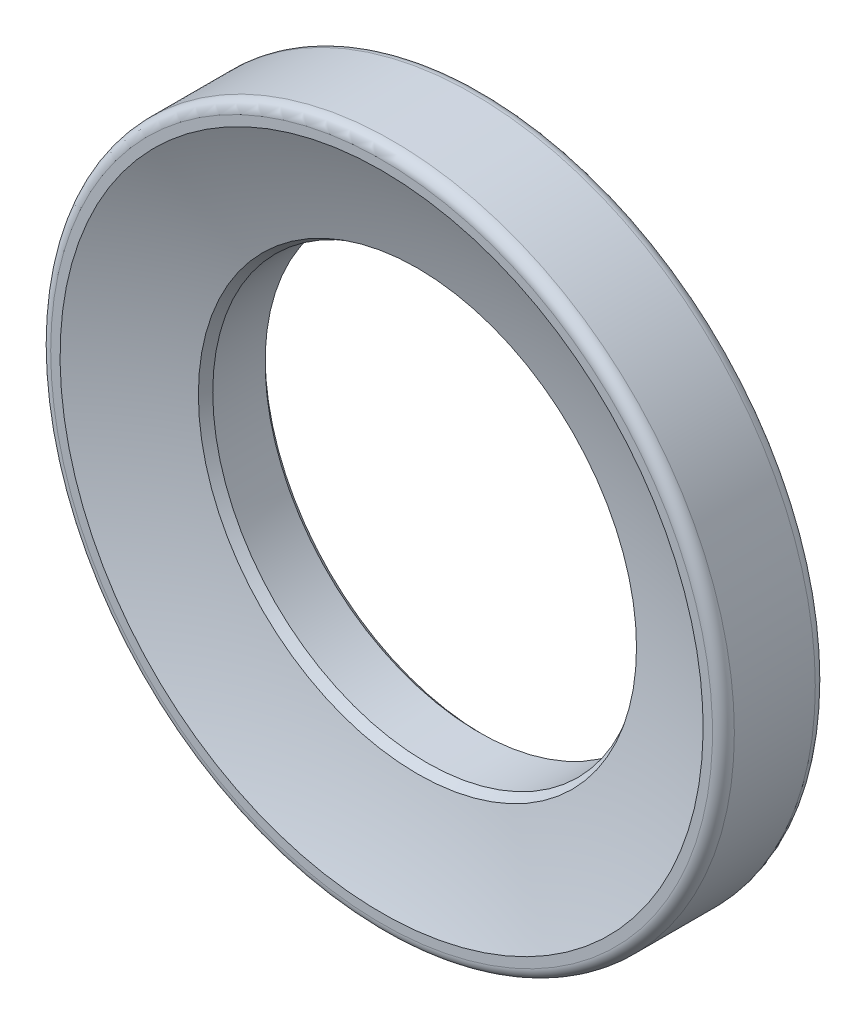
ISO-10303-21;
HEADER;
FILE_DESCRIPTION(('STEP AP214'),'2;1');
FILE_NAME('part.step','',(''),(''),'','','');
FILE_SCHEMA(('AUTOMOTIVE_DESIGN { 1 0 10303 214 1 1 1 1 }'));
ENDSEC;
DATA;
#1=APPLICATION_CONTEXT('core data for automotive mechanical design processes');
#2=APPLICATION_PROTOCOL_DEFINITION('international standard','automotive_design',2000,#1);
#3=PRODUCT_CONTEXT('',#1,'mechanical');
#4=PRODUCT('Part','Part','',(#3));
#5=PRODUCT_RELATED_PRODUCT_CATEGORY('part','',(#4));
#6=PRODUCT_DEFINITION_FORMATION('','',#4);
#7=PRODUCT_DEFINITION_CONTEXT('part definition',#1,'design');
#8=PRODUCT_DEFINITION('design','',#6,#7);
#9=PRODUCT_DEFINITION_SHAPE('','',#8);
#10=(LENGTH_UNIT() NAMED_UNIT(*) SI_UNIT(.MILLI.,.METRE.));
#11=(NAMED_UNIT(*) PLANE_ANGLE_UNIT() SI_UNIT($,.RADIAN.));
#12=(NAMED_UNIT(*) SI_UNIT($,.STERADIAN.) SOLID_ANGLE_UNIT());
#13=UNCERTAINTY_MEASURE_WITH_UNIT(LENGTH_MEASURE(1.E-05),#10,'distance_accuracy_value','');
#14=(GEOMETRIC_REPRESENTATION_CONTEXT(3) GLOBAL_UNCERTAINTY_ASSIGNED_CONTEXT((#13)) GLOBAL_UNIT_ASSIGNED_CONTEXT((#10,
#11,#12)) REPRESENTATION_CONTEXT('',''));
#15=CARTESIAN_POINT('',(0.,0.,0.));
#16=DIRECTION('',(0.,0.,1.));
#17=DIRECTION('',(1.,0.,0.));
#18=AXIS2_PLACEMENT_3D('',#15,#16,#17);
#19=CARTESIAN_POINT('',(0.,0.,0.));
#20=DIRECTION('',(0.,0.,1.));
#21=DIRECTION('',(1.,0.,0.));
#22=AXIS2_PLACEMENT_3D('',#19,#20,#21);
#23=CYLINDRICAL_SURFACE('',#22,15.875);
#24=CARTESIAN_POINT('',(0.,0.,-39.3192));
#25=DIRECTION('',(0.,0.,1.));
#26=DIRECTION('',(1.,0.,0.));
#27=AXIS2_PLACEMENT_3D('',#24,#25,#26);
#28=CIRCLE('',#27,15.875);
#29=CARTESIAN_POINT('',(15.875,0.,-39.3192));
#30=VERTEX_POINT('',#29);
#31=EDGE_CURVE('E42',#30,#30,#28,.T.);
#32=ORIENTED_EDGE('',*,*,#31,.T.);
#33=EDGE_LOOP('',(#32));
#34=FACE_BOUND('',#33,.T.);
#35=CARTESIAN_POINT('',(0.,0.,-35.56));
#36=DIRECTION('',(0.,0.,-1.));
#37=DIRECTION('',(-1.,0.,0.));
#38=AXIS2_PLACEMENT_3D('',#35,#36,#37);
#39=CIRCLE('',#38,15.875);
#40=CARTESIAN_POINT('',(-15.875,0.,-35.56));
#41=VERTEX_POINT('',#40);
#42=EDGE_CURVE('E46',#41,#41,#39,.T.);
#43=ORIENTED_EDGE('',*,*,#42,.T.);
#44=EDGE_LOOP('',(#43));
#45=FACE_BOUND('',#44,.T.);
#46=ADVANCED_FACE('F32',(#34,#45),#23,.T.);
#47=CARTESIAN_POINT('',(0.,15.875,-35.052));
#48=DIRECTION('',(0.,0.,-1.));
#49=DIRECTION('',(-1.,0.,0.));
#50=AXIS2_PLACEMENT_3D('',#47,#48,#49);
#51=PLANE('',#50);
#52=CARTESIAN_POINT('',(0.,0.,-35.052));
#53=DIRECTION('',(0.,0.,-1.));
#54=DIRECTION('',(-1.,0.,0.));
#55=AXIS2_PLACEMENT_3D('',#52,#53,#54);
#56=CIRCLE('',#55,15.367);
#57=CARTESIAN_POINT('',(-15.367,0.,-35.052));
#58=VERTEX_POINT('',#57);
#59=EDGE_CURVE('E10',#58,#58,#56,.F.);
#60=ORIENTED_EDGE('',*,*,#59,.T.);
#61=EDGE_LOOP('',(#60));
#62=FACE_BOUND('',#61,.T.);
#63=CARTESIAN_POINT('',(0.,0.,-35.052));
#64=DIRECTION('',(0.,0.,1.));
#65=DIRECTION('',(1.,0.,0.));
#66=AXIS2_PLACEMENT_3D('',#63,#64,#65);
#67=CIRCLE('',#66,14.9320894720063);
#68=CARTESIAN_POINT('',(0.,14.9320894720063,-35.052));
#69=VERTEX_POINT('',#68);
#70=EDGE_CURVE('E63',#69,#69,#67,.T.);
#71=ORIENTED_EDGE('',*,*,#70,.F.);
#72=EDGE_LOOP('',(#71));
#73=FACE_BOUND('',#72,.T.);
#74=ADVANCED_FACE('F69',(#62,#73),#51,.F.);
#75=CARTESIAN_POINT('',(0.,0.,0.));
#76=DIRECTION('',(0.,0.,1.));
#77=DIRECTION('',(0.,1.,0.));
#78=AXIS2_PLACEMENT_3D('',#75,#76,#77);
#79=SPHERICAL_SURFACE('',#78,38.1);
#80=CARTESIAN_POINT('',(0.,0.,-36.7165309109121));
#81=DIRECTION('',(0.,0.,1.));
#82=DIRECTION('',(1.,0.,0.));
#83=AXIS2_PLACEMENT_3D('',#80,#81,#82);
#84=CIRCLE('',#83,10.1738074420562);
#85=CARTESIAN_POINT('',(0.,10.1738074420561,-36.7165309109121));
#86=VERTEX_POINT('',#85);
#87=EDGE_CURVE('E54',#86,#86,#84,.F.);
#88=CARTESIAN_POINT('',(0.,10.1738074420561,-36.7165309109121));
#89=CARTESIAN_POINT('',(0.,10.2244483389096,-36.7024987925438));
#90=CARTESIAN_POINT('',(0.,10.2750602049246,-36.6883619040099));
#91=CARTESIAN_POINT('',(0.,10.3762250095633,-36.6598788314698));
#92=CARTESIAN_POINT('',(0.,10.426777948187,-36.6455326474637));
#93=CARTESIAN_POINT('',(0.,10.5278240323283,-36.6166312288387));
#94=CARTESIAN_POINT('',(0.,10.5783171778459,-36.6020759942199));
#95=CARTESIAN_POINT('',(0.,10.6792428113546,-36.5727567237682));
#96=CARTESIAN_POINT('',(0.,10.7296752993457,-36.5579926879353));
#97=CARTESIAN_POINT('',(0.,10.8304787543466,-36.5282560677715));
#98=CARTESIAN_POINT('',(0.,10.8808497213566,-36.5132834834407));
#99=CARTESIAN_POINT('',(0.,10.9815292720134,-36.4831300226368));
#100=CARTESIAN_POINT('',(0.,11.0318378556603,-36.4679491461637));
#101=CARTESIAN_POINT('',(0.,11.1323917782722,-36.4373793609784));
#102=CARTESIAN_POINT('',(0.,11.1826371172371,-36.4219904522663));
#103=CARTESIAN_POINT('',(0.,11.2830636902502,-36.3910048660728));
#104=CARTESIAN_POINT('',(0.,11.3332449242984,-36.3754081885914));
#105=CARTESIAN_POINT('',(0.,11.4335424283403,-36.3440073318852));
#106=CARTESIAN_POINT('',(0.,11.483658698334,-36.3282031526603));
#107=CARTESIAN_POINT('',(0.,11.5838254162416,-36.2963875630456));
#108=CARTESIAN_POINT('',(0.,11.6338758641555,-36.2803761526559));
#109=CARTESIAN_POINT('',(0.,11.7339100810051,-36.2481463748378));
#110=CARTESIAN_POINT('',(0.,11.7838938499407,-36.2319280074096));
#111=CARTESIAN_POINT('',(0.,11.883793853077,-36.1992845931843));
#112=CARTESIAN_POINT('',(0.,11.9337100872776,-36.1828595463873));
#113=CARTESIAN_POINT('',(0.,12.0334741663431,-36.1498030546327));
#114=CARTESIAN_POINT('',(0.,12.083322011208,-36.1331716096752));
#115=CARTESIAN_POINT('',(0.,12.1829484581725,-36.0997026063414));
#116=CARTESIAN_POINT('',(0.,12.232727060272,-36.0828650479652));
#117=CARTESIAN_POINT('',(0.,12.3322141694613,-36.0489841060649));
#118=CARTESIAN_POINT('',(0.,12.3819226765512,-36.0319407225407));
#119=CARTESIAN_POINT('',(0.,12.4812687446771,-35.997648422139));
#120=CARTESIAN_POINT('',(0.,12.5309063057131,-35.9803995052615));
#121=CARTESIAN_POINT('',(0.,12.6301096319018,-35.9456964334664));
#122=CARTESIAN_POINT('',(0.,12.6796753970544,-35.9282422785489));
#123=CARTESIAN_POINT('',(0.,12.7787342828761,-35.8931290295013));
#124=CARTESIAN_POINT('',(0.,12.8282274035451,-35.8754699353711));
#125=CARTESIAN_POINT('',(0.,12.9271401530428,-35.839947110234));
#126=CARTESIAN_POINT('',(0.,12.9765597818714,-35.8220833792271));
#127=CARTESIAN_POINT('',(0.,13.0753247015902,-35.786151586176));
#128=CARTESIAN_POINT('',(0.,13.1246699924802,-35.7680835241318));
#129=CARTESIAN_POINT('',(0.,13.2232853914959,-35.731743378344));
#130=CARTESIAN_POINT('',(0.,13.2725554996216,-35.7134712946004));
#131=CARTESIAN_POINT('',(0.,13.3710196895702,-35.6767234182444));
#132=CARTESIAN_POINT('',(0.,13.4202137713931,-35.658247625632));
#133=CARTESIAN_POINT('',(0.,13.5185250664993,-35.621092647857));
#134=CARTESIAN_POINT('',(0.,13.5676422797825,-35.6024134626943));
#135=CARTESIAN_POINT('',(0.,13.6657989968886,-35.5648520196193));
#136=CARTESIAN_POINT('',(0.,13.7148385007113,-35.545969761707));
#137=CARTESIAN_POINT('',(0.,13.8128389593061,-35.5080024964099));
#138=CARTESIAN_POINT('',(0.,13.861799914078,-35.4889174890252));
#139=CARTESIAN_POINT('',(0.,13.9596424363256,-35.4505450515323));
#140=CARTESIAN_POINT('',(0.,14.0085240038012,-35.4312576214241));
#141=CARTESIAN_POINT('',(0.,14.1062069145693,-35.3924806686974));
#142=CARTESIAN_POINT('',(0.,14.1550082578618,-35.3729911460788));
#143=CARTESIAN_POINT('',(0.,14.2525298847524,-35.3338103420094));
#144=CARTESIAN_POINT('',(0.,14.3012501683505,-35.3141190605584));
#145=CARTESIAN_POINT('',(0.,14.3986088417212,-35.2745350759386));
#146=CARTESIAN_POINT('',(0.,14.4472472314939,-35.2546423727697));
#147=CARTESIAN_POINT('',(0.,14.5444412845127,-35.214655885343));
#148=CARTESIAN_POINT('',(0.,14.5929969477589,-35.1945621010851));
#149=CARTESIAN_POINT('',(0.,14.6900247163362,-35.1541737953057));
#150=CARTESIAN_POINT('',(0.,14.7384968216673,-35.1338792737841));
#151=CARTESIAN_POINT('',(0.,14.8353566448439,-35.0930898416585));
#152=CARTESIAN_POINT('',(0.,14.8837443626892,-35.0725949310545));
#153=CARTESIAN_POINT('',(0.,14.9320894720063,-35.052));
#154=B_SPLINE_CURVE_WITH_KNOTS('',3,(#88,#89,#90,#91,#92,#93,#94,#95,#96,#97,#98,#99,#100,#101,
#102,#103,#104,#105,#106,#107,#108,#109,#110,#111,#112,#113,#114,#115,#116,#117,#118,#119,#120,
#121,#122,#123,#124,#125,#126,#127,#128,#129,#130,#131,#132,#133,#134,#135,#136,#137,#138,#139,
#140,#141,#142,#143,#144,#145,#146,#147,#148,#149,#150,#151,#152,#153),.UNSPECIFIED.,.F.,.F.,(4,
2,2,2,2,2,2,2,2,2,2,2,2,2,2,2,2,2,2,2,2,2,2,2,2,2,2,2,2,2,2,2,4),(0.,0.157646983985663,
0.315293967971323,0.472940951956984,0.630587935942644,0.788234919928297,0.945881903913958,
1.10352888789962,1.26117587188528,1.41882285587094,1.5764698398566,1.73411682384226,
1.89176380782792,2.04941079181358,2.20705777579924,2.3647047597849,2.52235174377056,
2.67999872775622,2.83764571174188,2.99529269572755,3.15293967971321,3.31058666369886,
3.46823364768452,3.62588063167018,3.78352761565584,3.9411745996415,4.09882158362716,
4.25646856761282,4.41411555159848,4.57176253558414,4.7294095195698,4.88705650355546,
5.04470348754112),.UNSPECIFIED.);
#155=EDGE_CURVE('BSEAM67',#86,#69,#154,.T.);
#156=ORIENTED_EDGE('',*,*,#87,.T.);
#157=ORIENTED_EDGE('',*,*,#70,.T.);
#158=ORIENTED_EDGE('',*,*,#155,.T.);
#159=ORIENTED_EDGE('',*,*,#155,.F.);
#160=EDGE_LOOP('',(#156,#158,#157,#159));
#161=FACE_BOUND('',#160,.T.);
#162=ADVANCED_FACE('F67',(#161),#79,.F.);
#163=CARTESIAN_POINT('',(0.,0.,0.));
#164=DIRECTION('',(0.,0.,1.));
#165=DIRECTION('',(1.,0.,0.));
#166=AXIS2_PLACEMENT_3D('',#163,#164,#165);
#167=CYLINDRICAL_SURFACE('',#166,9.9314);
#168=CARTESIAN_POINT('',(0.,0.,-37.1423764387392));
#169=DIRECTION('',(0.,0.,-1.));
#170=DIRECTION('',(-1.,0.,0.));
#171=AXIS2_PLACEMENT_3D('',#168,#169,#170);
#172=CIRCLE('',#171,9.9314);
#173=CARTESIAN_POINT('',(-9.9314,0.,-37.1423764387392));
#174=VERTEX_POINT('',#173);
#175=EDGE_CURVE('E57',#174,#174,#172,.F.);
#176=ORIENTED_EDGE('',*,*,#175,.T.);
#177=EDGE_LOOP('',(#176));
#178=FACE_BOUND('',#177,.T.);
#179=CARTESIAN_POINT('',(0.,0.,-39.5732));
#180=DIRECTION('',(0.,0.,1.));
#181=DIRECTION('',(1.,0.,0.));
#182=AXIS2_PLACEMENT_3D('',#179,#180,#181);
#183=CIRCLE('',#182,9.9314);
#184=CARTESIAN_POINT('',(9.9314,0.,-39.5732));
#185=VERTEX_POINT('',#184);
#186=EDGE_CURVE('E60',#185,#185,#183,.F.);
#187=ORIENTED_EDGE('',*,*,#186,.T.);
#188=EDGE_LOOP('',(#187));
#189=FACE_BOUND('',#188,.T.);
#190=ADVANCED_FACE('F75',(#178,#189),#167,.F.);
#191=CARTESIAN_POINT('',(0.,15.875,-39.8272));
#192=DIRECTION('',(0.,0.,1.));
#193=DIRECTION('',(1.,0.,0.));
#194=AXIS2_PLACEMENT_3D('',#191,#192,#193);
#195=PLANE('',#194);
#196=CARTESIAN_POINT('',(0.,0.,-39.8272));
#197=DIRECTION('',(0.,0.,1.));
#198=DIRECTION('',(1.,0.,0.));
#199=AXIS2_PLACEMENT_3D('',#196,#197,#198);
#200=CIRCLE('',#199,15.367);
#201=CARTESIAN_POINT('',(15.367,0.,-39.8272));
#202=VERTEX_POINT('',#201);
#203=EDGE_CURVE('E38',#202,#202,#200,.F.);
#204=ORIENTED_EDGE('',*,*,#203,.T.);
#205=EDGE_LOOP('',(#204));
#206=FACE_BOUND('',#205,.T.);
#207=CARTESIAN_POINT('',(0.,0.,-39.8272));
#208=DIRECTION('',(0.,0.,1.));
#209=DIRECTION('',(1.,0.,0.));
#210=AXIS2_PLACEMENT_3D('',#207,#208,#209);
#211=CIRCLE('',#210,10.1854);
#212=CARTESIAN_POINT('',(10.1854,0.,-39.8272));
#213=VERTEX_POINT('',#212);
#214=EDGE_CURVE('E51',#213,#213,#211,.T.);
#215=ORIENTED_EDGE('',*,*,#214,.T.);
#216=EDGE_LOOP('',(#215));
#217=FACE_BOUND('',#216,.T.);
#218=ADVANCED_FACE('F82',(#206,#217),#195,.F.);
#219=CARTESIAN_POINT('',(0.,0.,-37.1423764387392));
#220=DIRECTION('',(0.,0.,1.));
#221=DIRECTION('',(1.,0.,0.));
#222=AXIS2_PLACEMENT_3D('',#219,#220,#221);
#223=CONICAL_SURFACE('',#222,9.9314,0.517493176425556);
#224=ORIENTED_EDGE('',*,*,#87,.F.);
#225=EDGE_LOOP('',(#224));
#226=FACE_BOUND('',#225,.T.);
#227=ORIENTED_EDGE('',*,*,#175,.F.);
#228=EDGE_LOOP('',(#227));
#229=FACE_BOUND('',#228,.T.);
#230=ADVANCED_FACE('F86',(#226,#229),#223,.F.);
#231=CARTESIAN_POINT('',(0.,0.,-39.8272));
#232=DIRECTION('',(0.,0.,-1.));
#233=DIRECTION('',(-1.,0.,0.));
#234=AXIS2_PLACEMENT_3D('',#231,#232,#233);
#235=CONICAL_SURFACE('',#234,10.1854,0.785398163397445);
#236=ORIENTED_EDGE('',*,*,#186,.F.);
#237=EDGE_LOOP('',(#236));
#238=FACE_BOUND('',#237,.T.);
#239=ORIENTED_EDGE('',*,*,#214,.F.);
#240=EDGE_LOOP('',(#239));
#241=FACE_BOUND('',#240,.T.);
#242=ADVANCED_FACE('F89',(#238,#241),#235,.F.);
#243=CARTESIAN_POINT('',(0.,0.,-39.3192));
#244=DIRECTION('',(0.,0.,1.));
#245=DIRECTION('',(1.,0.,0.));
#246=AXIS2_PLACEMENT_3D('',#243,#244,#245);
#247=TOROIDAL_SURFACE('',#246,15.367,0.508);
#248=ORIENTED_EDGE('',*,*,#203,.F.);
#249=EDGE_LOOP('',(#248));
#250=FACE_BOUND('',#249,.T.);
#251=ORIENTED_EDGE('',*,*,#31,.F.);
#252=EDGE_LOOP('',(#251));
#253=FACE_BOUND('',#252,.T.);
#254=ADVANCED_FACE('F93',(#250,#253),#247,.T.);
#255=CARTESIAN_POINT('',(0.,0.,-35.56));
#256=DIRECTION('',(0.,0.,-1.));
#257=DIRECTION('',(-1.,0.,0.));
#258=AXIS2_PLACEMENT_3D('',#255,#256,#257);
#259=TOROIDAL_SURFACE('',#258,15.367,0.508);
#260=ORIENTED_EDGE('',*,*,#42,.F.);
#261=EDGE_LOOP('',(#260));
#262=FACE_BOUND('',#261,.T.);
#263=ORIENTED_EDGE('',*,*,#59,.F.);
#264=EDGE_LOOP('',(#263));
#265=FACE_BOUND('',#264,.T.);
#266=ADVANCED_FACE('F97',(#262,#265),#259,.T.);
#267=CLOSED_SHELL('',(#46,#74,#162,#190,#218,#230,#242,#254,#266));
#268=MANIFOLD_SOLID_BREP('B2',#267);
#269=ADVANCED_BREP_SHAPE_REPRESENTATION('',(#18,#268),#14);
#270=SHAPE_DEFINITION_REPRESENTATION(#9,#269);
ENDSEC;
END-ISO-10303-21;
